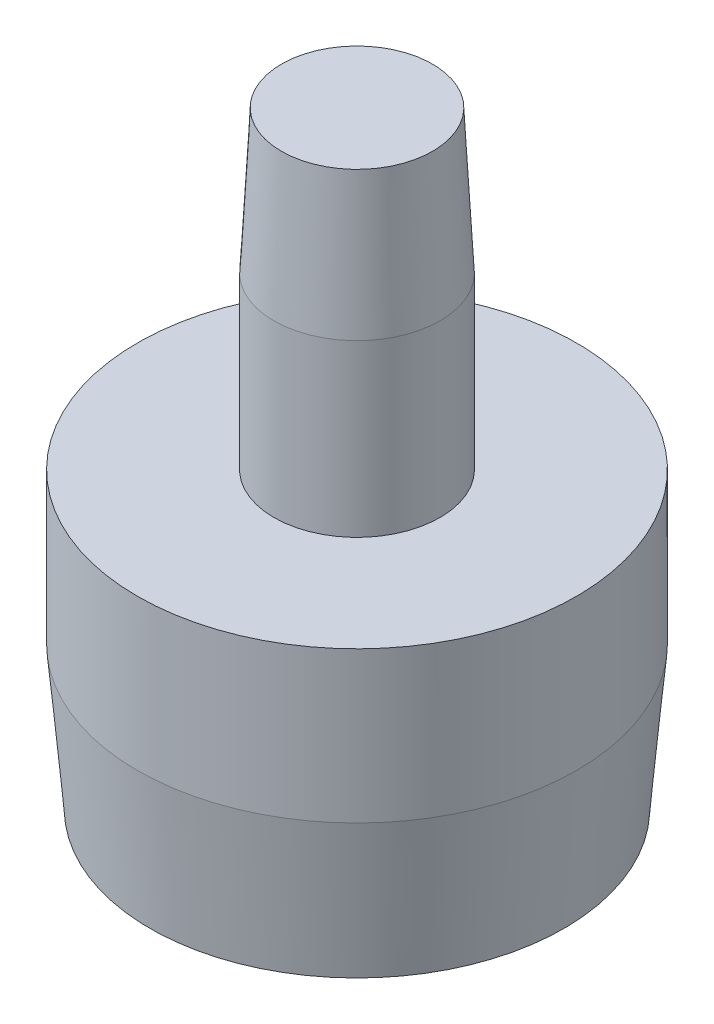
ISO-10303-21;
HEADER;
FILE_DESCRIPTION(('STEP AP214'),'2;1');
FILE_NAME('part.step','',(''),(''),'','','');
FILE_SCHEMA(('AUTOMOTIVE_DESIGN { 1 0 10303 214 1 1 1 1 }'));
ENDSEC;
DATA;
#1=APPLICATION_CONTEXT('core data for automotive mechanical design processes');
#2=APPLICATION_PROTOCOL_DEFINITION('international standard','automotive_design',2000,#1);
#3=PRODUCT_CONTEXT('',#1,'mechanical');
#4=PRODUCT('Part','Part','',(#3));
#5=PRODUCT_RELATED_PRODUCT_CATEGORY('part','',(#4));
#6=PRODUCT_DEFINITION_FORMATION('','',#4);
#7=PRODUCT_DEFINITION_CONTEXT('part definition',#1,'design');
#8=PRODUCT_DEFINITION('design','',#6,#7);
#9=PRODUCT_DEFINITION_SHAPE('','',#8);
#10=(LENGTH_UNIT() NAMED_UNIT(*) SI_UNIT(.MILLI.,.METRE.));
#11=(NAMED_UNIT(*) PLANE_ANGLE_UNIT() SI_UNIT($,.RADIAN.));
#12=(NAMED_UNIT(*) SI_UNIT($,.STERADIAN.) SOLID_ANGLE_UNIT());
#13=UNCERTAINTY_MEASURE_WITH_UNIT(LENGTH_MEASURE(1.E-05),#10,'distance_accuracy_value','');
#14=(GEOMETRIC_REPRESENTATION_CONTEXT(3) GLOBAL_UNCERTAINTY_ASSIGNED_CONTEXT((#13)) GLOBAL_UNIT_ASSIGNED_CONTEXT((#10,
#11,#12)) REPRESENTATION_CONTEXT('',''));
#15=CARTESIAN_POINT('',(0.,0.,0.));
#16=DIRECTION('',(0.,0.,1.));
#17=DIRECTION('',(1.,0.,0.));
#18=AXIS2_PLACEMENT_3D('',#15,#16,#17);
#19=CARTESIAN_POINT('',(0.,-33.2169707634001,0.));
#20=DIRECTION('',(0.,-1.,0.));
#21=DIRECTION('',(0.,0.,-1.));
#22=AXIS2_PLACEMENT_3D('',#19,#20,#21);
#23=PLANE('',#22);
#24=CARTESIAN_POINT('',(0.,-33.2169707634001,0.));
#25=DIRECTION('',(0.,-1.,0.));
#26=DIRECTION('',(0.,0.,-1.));
#27=AXIS2_PLACEMENT_3D('',#24,#25,#26);
#28=CIRCLE('',#27,43.1120738594188);
#29=CARTESIAN_POINT('',(0.,-33.2169707634001,-43.1120738594188));
#30=VERTEX_POINT('',#29);
#31=EDGE_CURVE('E56',#30,#30,#28,.T.);
#32=ORIENTED_EDGE('',*,*,#31,.T.);
#33=EDGE_LOOP('',(#32));
#34=FACE_BOUND('',#33,.T.);
#35=ADVANCED_FACE('F51',(#34),#23,.T.);
#36=CARTESIAN_POINT('',(0.,-3.39953961485057,0.));
#37=DIRECTION('',(0.,1.,0.));
#38=DIRECTION('',(0.,0.,-1.));
#39=AXIS2_PLACEMENT_3D('',#36,#37,#38);
#40=CONICAL_SURFACE('',#39,45.7207610603817,0.0872664625997167);
#41=ORIENTED_EDGE('',*,*,#31,.F.);
#42=EDGE_LOOP('',(#41));
#43=FACE_BOUND('',#42,.T.);
#44=CARTESIAN_POINT('',(0.,-3.4169707634001,0.));
#45=DIRECTION('',(0.,1.,0.));
#46=DIRECTION('',(0.,0.,1.));
#47=AXIS2_PLACEMENT_3D('',#44,#45,#46);
#48=CIRCLE('',#47,45.72);
#49=CARTESIAN_POINT('',(0.,-3.4169707634001,45.72));
#50=VERTEX_POINT('',#49);
#51=EDGE_CURVE('E13',#50,#50,#48,.T.);
#52=ORIENTED_EDGE('',*,*,#51,.F.);
#53=EDGE_LOOP('',(#52));
#54=FACE_BOUND('',#53,.T.);
#55=ADVANCED_FACE('F53',(#43,#54),#40,.T.);
#56=CARTESIAN_POINT('',(0.,93.2830292365999,0.));
#57=DIRECTION('',(0.,1.,0.));
#58=DIRECTION('',(0.,0.,1.));
#59=AXIS2_PLACEMENT_3D('',#56,#57,#58);
#60=PLANE('',#59);
#61=CARTESIAN_POINT('',(0.,93.2830292365999,0.));
#62=DIRECTION('',(0.,1.,0.));
#63=DIRECTION('',(0.,0.,1.));
#64=AXIS2_PLACEMENT_3D('',#61,#62,#63);
#65=CIRCLE('',#64,15.7379737081658);
#66=CARTESIAN_POINT('',(0.,93.2830292365999,15.7379737081658));
#67=VERTEX_POINT('',#66);
#68=EDGE_CURVE('E101',#67,#67,#65,.T.);
#69=ORIENTED_EDGE('',*,*,#68,.T.);
#70=EDGE_LOOP('',(#69));
#71=FACE_BOUND('',#70,.T.);
#72=ADVANCED_FACE('F90',(#71),#60,.T.);
#73=CARTESIAN_POINT('',(0.,63.4725620453513,0.));
#74=DIRECTION('',(0.,-1.,0.));
#75=DIRECTION('',(0.,0.,1.));
#76=AXIS2_PLACEMENT_3D('',#73,#74,#75);
#77=CONICAL_SURFACE('',#76,17.3002740930491,0.05235987755983);
#78=ORIENTED_EDGE('',*,*,#68,.F.);
#79=EDGE_LOOP('',(#78));
#80=FACE_BOUND('',#79,.T.);
#81=CARTESIAN_POINT('',(0.,63.4830292365999,0.));
#82=DIRECTION('',(0.,1.,0.));
#83=DIRECTION('',(0.,0.,1.));
#84=AXIS2_PLACEMENT_3D('',#81,#82,#83);
#85=CIRCLE('',#84,17.2997255308004);
#86=CARTESIAN_POINT('',(0.,63.4830292365999,17.2997255308004));
#87=VERTEX_POINT('',#86);
#88=EDGE_CURVE('E70',#87,#87,#85,.T.);
#89=ORIENTED_EDGE('',*,*,#88,.T.);
#90=EDGE_LOOP('',(#89));
#91=FACE_BOUND('',#90,.T.);
#92=ADVANCED_FACE('F80',(#80,#91),#77,.T.);
#93=CARTESIAN_POINT('',(0.,94.4786106319487,0.));
#94=DIRECTION('',(0.,1.,0.));
#95=DIRECTION('',(0.,0.,1.));
#96=AXIS2_PLACEMENT_3D('',#93,#94,#95);
#97=CYLINDRICAL_SURFACE('',#96,17.3);
#98=CARTESIAN_POINT('',(0.,28.0030292365999,0.));
#99=DIRECTION('',(0.,1.,0.));
#100=DIRECTION('',(0.,0.,1.));
#101=AXIS2_PLACEMENT_3D('',#98,#99,#100);
#102=CIRCLE('',#101,17.3);
#103=CARTESIAN_POINT('',(0.,28.0030292365999,17.3));
#104=VERTEX_POINT('',#103);
#105=EDGE_CURVE('E65',#104,#104,#102,.T.);
#106=ORIENTED_EDGE('',*,*,#105,.T.);
#107=EDGE_LOOP('',(#106));
#108=FACE_BOUND('',#107,.T.);
#109=ORIENTED_EDGE('',*,*,#88,.F.);
#110=EDGE_LOOP('',(#109));
#111=FACE_BOUND('',#110,.T.);
#112=ADVANCED_FACE('F89',(#108,#111),#97,.T.);
#113=CARTESIAN_POINT('',(48.72,28.0030292365999,0.));
#114=DIRECTION('',(0.,1.,0.));
#115=DIRECTION('',(0.,0.,1.));
#116=AXIS2_PLACEMENT_3D('',#113,#114,#115);
#117=PLANE('',#116);
#118=CARTESIAN_POINT('',(0.,28.0030292365999,0.));
#119=DIRECTION('',(0.,1.,0.));
#120=DIRECTION('',(0.,0.,1.));
#121=AXIS2_PLACEMENT_3D('',#118,#119,#120);
#122=CIRCLE('',#121,45.72);
#123=CARTESIAN_POINT('',(0.,28.0030292365999,45.72));
#124=VERTEX_POINT('',#123);
#125=EDGE_CURVE('E60',#124,#124,#122,.T.);
#126=ORIENTED_EDGE('',*,*,#125,.T.);
#127=EDGE_LOOP('',(#126));
#128=FACE_BOUND('',#127,.T.);
#129=ORIENTED_EDGE('',*,*,#105,.F.);
#130=EDGE_LOOP('',(#129));
#131=FACE_BOUND('',#130,.T.);
#132=ADVANCED_FACE('F130',(#128,#131),#117,.T.);
#133=CARTESIAN_POINT('',(0.,94.4786106319487,0.));
#134=DIRECTION('',(0.,1.,0.));
#135=DIRECTION('',(0.,0.,1.));
#136=AXIS2_PLACEMENT_3D('',#133,#134,#135);
#137=CYLINDRICAL_SURFACE('',#136,45.72);
#138=ORIENTED_EDGE('',*,*,#51,.T.);
#139=EDGE_LOOP('',(#138));
#140=FACE_BOUND('',#139,.T.);
#141=ORIENTED_EDGE('',*,*,#125,.F.);
#142=EDGE_LOOP('',(#141));
#143=FACE_BOUND('',#142,.T.);
#144=ADVANCED_FACE('F132',(#140,#143),#137,.T.);
#145=CLOSED_SHELL('',(#35,#55,#72,#92,#112,#132,#144));
#146=MANIFOLD_SOLID_BREP('B2',#145);
#147=ADVANCED_BREP_SHAPE_REPRESENTATION('',(#18,#146),#14);
#148=SHAPE_DEFINITION_REPRESENTATION(#9,#147);
ENDSEC;
END-ISO-10303-21;
